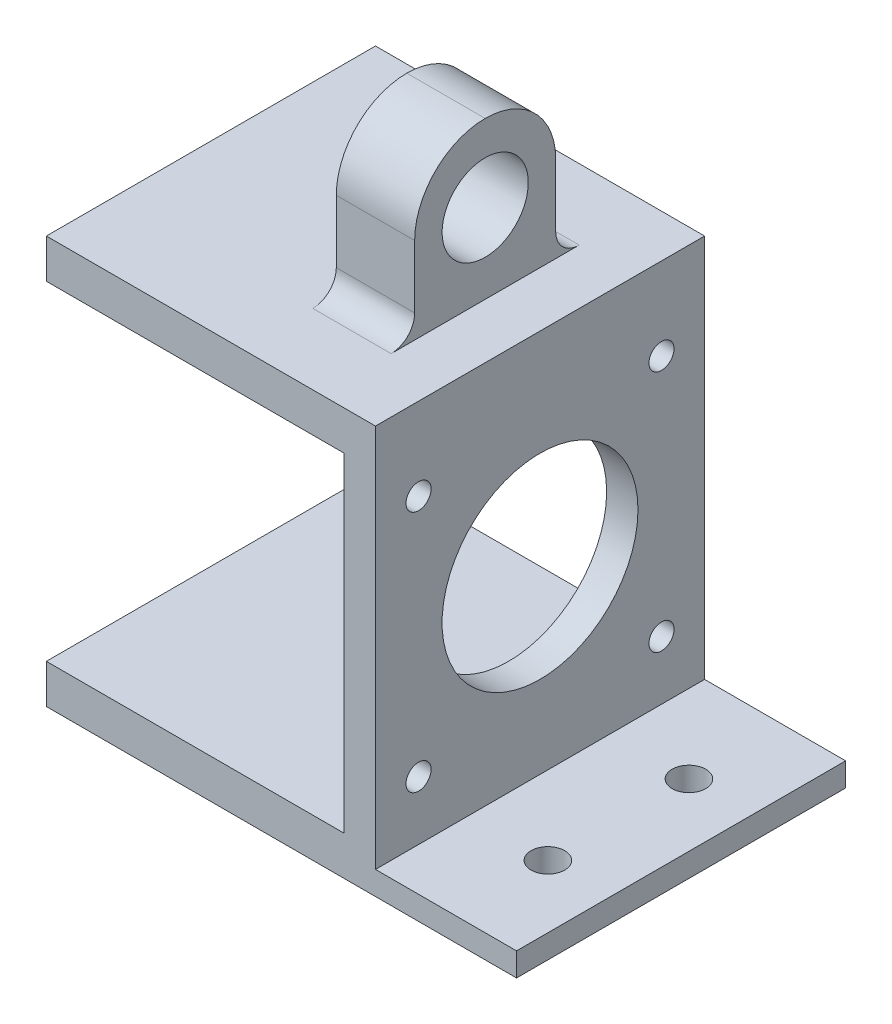
ISO-10303-21;
HEADER;
FILE_DESCRIPTION(('STEP AP214'),'2;1');
FILE_NAME('part.step','',(''),(''),'','','');
FILE_SCHEMA(('AUTOMOTIVE_DESIGN { 1 0 10303 214 1 1 1 1 }'));
ENDSEC;
DATA;
#1=APPLICATION_CONTEXT('core data for automotive mechanical design processes');
#2=APPLICATION_PROTOCOL_DEFINITION('international standard','automotive_design',2000,#1);
#3=PRODUCT_CONTEXT('',#1,'mechanical');
#4=PRODUCT('Part','Part','',(#3));
#5=PRODUCT_RELATED_PRODUCT_CATEGORY('part','',(#4));
#6=PRODUCT_DEFINITION_FORMATION('','',#4);
#7=PRODUCT_DEFINITION_CONTEXT('part definition',#1,'design');
#8=PRODUCT_DEFINITION('design','',#6,#7);
#9=PRODUCT_DEFINITION_SHAPE('','',#8);
#10=(LENGTH_UNIT() NAMED_UNIT(*) SI_UNIT(.MILLI.,.METRE.));
#11=(NAMED_UNIT(*) PLANE_ANGLE_UNIT() SI_UNIT($,.RADIAN.));
#12=(NAMED_UNIT(*) SI_UNIT($,.STERADIAN.) SOLID_ANGLE_UNIT());
#13=UNCERTAINTY_MEASURE_WITH_UNIT(LENGTH_MEASURE(1.E-05),#10,'distance_accuracy_value','');
#14=(GEOMETRIC_REPRESENTATION_CONTEXT(3) GLOBAL_UNCERTAINTY_ASSIGNED_CONTEXT((#13)) GLOBAL_UNIT_ASSIGNED_CONTEXT((#10,
#11,#12)) REPRESENTATION_CONTEXT('',''));
#15=CARTESIAN_POINT('',(0.,0.,0.));
#16=DIRECTION('',(0.,0.,1.));
#17=DIRECTION('',(1.,0.,0.));
#18=AXIS2_PLACEMENT_3D('',#15,#16,#17);
#19=CARTESIAN_POINT('',(0.,3.,0.));
#20=DIRECTION('',(0.,1.,0.));
#21=DIRECTION('',(0.,0.,1.));
#22=AXIS2_PLACEMENT_3D('',#19,#20,#21);
#23=PLANE('',#22);
#24=DIRECTION('',(0.,0.,1.));
#25=VECTOR('',#24,1.);
#26=CARTESIAN_POINT('',(22.,3.,0.));
#27=LINE('',#26,#25);
#28=CARTESIAN_POINT('',(22.,3.,0.));
#29=VERTEX_POINT('',#28);
#30=CARTESIAN_POINT('',(22.,3.,42.));
#31=VERTEX_POINT('',#30);
#32=EDGE_CURVE('E229',#29,#31,#27,.T.);
#33=ORIENTED_EDGE('',*,*,#32,.F.);
#34=DIRECTION('',(-1.,0.,0.));
#35=VECTOR('',#34,1.);
#36=CARTESIAN_POINT('',(0.,3.,0.));
#37=LINE('',#36,#35);
#38=CARTESIAN_POINT('',(4.,3.,0.));
#39=VERTEX_POINT('',#38);
#40=EDGE_CURVE('E178',#29,#39,#37,.T.);
#41=ORIENTED_EDGE('',*,*,#40,.T.);
#42=DIRECTION('',(0.,0.,-1.));
#43=VECTOR('',#42,1.);
#44=CARTESIAN_POINT('',(4.,3.,0.));
#45=LINE('',#44,#43);
#46=CARTESIAN_POINT('',(4.,3.,42.));
#47=VERTEX_POINT('',#46);
#48=EDGE_CURVE('E193',#47,#39,#45,.T.);
#49=ORIENTED_EDGE('',*,*,#48,.F.);
#50=DIRECTION('',(1.,0.,0.));
#51=VECTOR('',#50,1.);
#52=CARTESIAN_POINT('',(0.,3.,42.));
#53=LINE('',#52,#51);
#54=EDGE_CURVE('E186',#47,#31,#53,.T.);
#55=ORIENTED_EDGE('',*,*,#54,.T.);
#56=EDGE_LOOP('',(#33,#41,#49,#55));
#57=FACE_BOUND('',#56,.T.);
#58=CARTESIAN_POINT('',(14.,3.,30.));
#59=DIRECTION('',(0.,1.,0.));
#60=DIRECTION('',(0.,0.,1.));
#61=AXIS2_PLACEMENT_3D('',#58,#59,#60);
#62=CIRCLE('',#61,2.15);
#63=CARTESIAN_POINT('',(14.,3.,32.15));
#64=VERTEX_POINT('',#63);
#65=EDGE_CURVE('E289',#64,#64,#62,.T.);
#66=ORIENTED_EDGE('',*,*,#65,.F.);
#67=EDGE_LOOP('',(#66));
#68=FACE_BOUND('',#67,.T.);
#69=CARTESIAN_POINT('',(14.,3.,12.));
#70=DIRECTION('',(0.,1.,0.));
#71=DIRECTION('',(0.,0.,1.));
#72=AXIS2_PLACEMENT_3D('',#69,#70,#71);
#73=CIRCLE('',#72,2.15);
#74=CARTESIAN_POINT('',(14.,3.,14.15));
#75=VERTEX_POINT('',#74);
#76=EDGE_CURVE('E297',#75,#75,#73,.T.);
#77=ORIENTED_EDGE('',*,*,#76,.F.);
#78=EDGE_LOOP('',(#77));
#79=FACE_BOUND('',#78,.T.);
#80=ADVANCED_FACE('F45',(#57,#68,#79),#23,.T.);
#81=CARTESIAN_POINT('',(0.,3.,42.));
#82=DIRECTION('',(0.,0.,-1.));
#83=DIRECTION('',(-1.,0.,0.));
#84=AXIS2_PLACEMENT_3D('',#81,#82,#83);
#85=PLANE('',#84);
#86=DIRECTION('',(1.,0.,0.));
#87=VECTOR('',#86,1.);
#88=CARTESIAN_POINT('',(0.,0.,42.));
#89=LINE('',#88,#87);
#90=CARTESIAN_POINT('',(-38.,0.,42.));
#91=VERTEX_POINT('',#90);
#92=CARTESIAN_POINT('',(22.,0.,42.));
#93=VERTEX_POINT('',#92);
#94=EDGE_CURVE('E187',#91,#93,#89,.T.);
#95=ORIENTED_EDGE('',*,*,#94,.T.);
#96=DIRECTION('',(0.,1.,0.));
#97=VECTOR('',#96,1.);
#98=CARTESIAN_POINT('',(22.,3.,42.));
#99=LINE('',#98,#97);
#100=EDGE_CURVE('E61',#93,#31,#99,.T.);
#101=ORIENTED_EDGE('',*,*,#100,.T.);
#102=ORIENTED_EDGE('',*,*,#54,.F.);
#103=DIRECTION('',(0.,-1.,0.));
#104=VECTOR('',#103,1.);
#105=CARTESIAN_POINT('',(4.00000000000001,47.,42.));
#106=LINE('',#105,#104);
#107=CARTESIAN_POINT('',(4.,52.,42.));
#108=VERTEX_POINT('',#107);
#109=EDGE_CURVE('E403',#108,#47,#106,.T.);
#110=ORIENTED_EDGE('',*,*,#109,.F.);
#111=DIRECTION('',(1.,0.,0.));
#112=VECTOR('',#111,1.);
#113=CARTESIAN_POINT('',(4.,52.,42.));
#114=LINE('',#113,#112);
#115=CARTESIAN_POINT('',(-38.,52.,42.));
#116=VERTEX_POINT('',#115);
#117=EDGE_CURVE('E316',#116,#108,#114,.T.);
#118=ORIENTED_EDGE('',*,*,#117,.F.);
#119=DIRECTION('',(0.,-1.,0.));
#120=VECTOR('',#119,1.);
#121=CARTESIAN_POINT('',(-38.,52.,42.));
#122=LINE('',#121,#120);
#123=CARTESIAN_POINT('',(-38.,47.,42.));
#124=VERTEX_POINT('',#123);
#125=EDGE_CURVE('E320',#116,#124,#122,.T.);
#126=ORIENTED_EDGE('',*,*,#125,.T.);
#127=DIRECTION('',(1.,0.,0.));
#128=VECTOR('',#127,1.);
#129=CARTESIAN_POINT('',(4.,47.,42.));
#130=LINE('',#129,#128);
#131=CARTESIAN_POINT('',(0.,47.,42.));
#132=VERTEX_POINT('',#131);
#133=EDGE_CURVE('E310',#124,#132,#130,.T.);
#134=ORIENTED_EDGE('',*,*,#133,.T.);
#135=DIRECTION('',(0.,-1.,0.));
#136=VECTOR('',#135,1.);
#137=CARTESIAN_POINT('',(0.,3.,42.));
#138=LINE('',#137,#136);
#139=CARTESIAN_POINT('',(0.,5.,42.));
#140=VERTEX_POINT('',#139);
#141=EDGE_CURVE('E200',#132,#140,#138,.T.);
#142=ORIENTED_EDGE('',*,*,#141,.T.);
#143=DIRECTION('',(1.,0.,0.));
#144=VECTOR('',#143,1.);
#145=CARTESIAN_POINT('',(-38.,5.,42.));
#146=LINE('',#145,#144);
#147=CARTESIAN_POINT('',(-38.,5.,42.));
#148=VERTEX_POINT('',#147);
#149=EDGE_CURVE('E354',#148,#140,#146,.T.);
#150=ORIENTED_EDGE('',*,*,#149,.F.);
#151=DIRECTION('',(0.,1.,0.));
#152=VECTOR('',#151,1.);
#153=CARTESIAN_POINT('',(-38.,0.,42.));
#154=LINE('',#153,#152);
#155=EDGE_CURVE('E341',#91,#148,#154,.T.);
#156=ORIENTED_EDGE('',*,*,#155,.F.);
#157=EDGE_LOOP('',(#95,#101,#102,#110,#118,#126,#134,#142,#150,#156));
#158=FACE_BOUND('',#157,.T.);
#159=ADVANCED_FACE('F425',(#158),#85,.F.);
#160=CARTESIAN_POINT('',(0.,52.,0.));
#161=DIRECTION('',(0.,-1.,0.));
#162=DIRECTION('',(0.,0.,-1.));
#163=AXIS2_PLACEMENT_3D('',#160,#161,#162);
#164=PLANE('',#163);
#165=DIRECTION('',(0.,0.,-1.));
#166=VECTOR('',#165,1.);
#167=CARTESIAN_POINT('',(4.,52.,0.));
#168=LINE('',#167,#166);
#169=CARTESIAN_POINT('',(4.,52.,0.));
#170=VERTEX_POINT('',#169);
#171=EDGE_CURVE('E305',#108,#170,#168,.T.);
#172=ORIENTED_EDGE('',*,*,#171,.T.);
#173=DIRECTION('',(-1.,0.,0.));
#174=VECTOR('',#173,1.);
#175=CARTESIAN_POINT('',(4.,52.,0.));
#176=LINE('',#175,#174);
#177=CARTESIAN_POINT('',(-38.,52.,0.));
#178=VERTEX_POINT('',#177);
#179=EDGE_CURVE('E309',#170,#178,#176,.T.);
#180=ORIENTED_EDGE('',*,*,#179,.T.);
#181=DIRECTION('',(0.,0.,1.));
#182=VECTOR('',#181,1.);
#183=CARTESIAN_POINT('',(-38.,52.,0.));
#184=LINE('',#183,#182);
#185=EDGE_CURVE('E313',#178,#116,#184,.T.);
#186=ORIENTED_EDGE('',*,*,#185,.T.);
#187=ORIENTED_EDGE('',*,*,#117,.T.);
#188=EDGE_LOOP('',(#172,#180,#186,#187));
#189=FACE_BOUND('',#188,.T.);
#190=DIRECTION('',(0.,0.,1.));
#191=VECTOR('',#190,1.);
#192=CARTESIAN_POINT('',(-13.,52.,12.));
#193=LINE('',#192,#191);
#194=CARTESIAN_POINT('',(-13.,52.,9.));
#195=VERTEX_POINT('',#194);
#196=CARTESIAN_POINT('',(-13.,52.,33.));
#197=VERTEX_POINT('',#196);
#198=EDGE_CURVE('E265',#195,#197,#193,.T.);
#199=ORIENTED_EDGE('',*,*,#198,.F.);
#200=DIRECTION('',(-1.,0.,0.));
#201=VECTOR('',#200,1.);
#202=CARTESIAN_POINT('',(-3.,52.,9.));
#203=LINE('',#202,#201);
#204=CARTESIAN_POINT('',(-3.,52.,9.));
#205=VERTEX_POINT('',#204);
#206=EDGE_CURVE('E237',#195,#205,#203,.F.);
#207=ORIENTED_EDGE('',*,*,#206,.T.);
#208=DIRECTION('',(0.,0.,-1.));
#209=VECTOR('',#208,1.);
#210=CARTESIAN_POINT('',(-3.,52.,12.));
#211=LINE('',#210,#209);
#212=CARTESIAN_POINT('',(-2.99999999999999,52.,33.));
#213=VERTEX_POINT('',#212);
#214=EDGE_CURVE('E258',#213,#205,#211,.T.);
#215=ORIENTED_EDGE('',*,*,#214,.F.);
#216=DIRECTION('',(1.,0.,0.));
#217=VECTOR('',#216,1.);
#218=CARTESIAN_POINT('',(-13.,52.,33.));
#219=LINE('',#218,#217);
#220=EDGE_CURVE('E233',#213,#197,#219,.F.);
#221=ORIENTED_EDGE('',*,*,#220,.T.);
#222=EDGE_LOOP('',(#199,#207,#215,#221));
#223=FACE_BOUND('',#222,.T.);
#224=ADVANCED_FACE('F264',(#189,#223),#164,.F.);
#225=CARTESIAN_POINT('',(0.,3.,0.));
#226=DIRECTION('',(1.,0.,0.));
#227=DIRECTION('',(0.,0.,-1.));
#228=AXIS2_PLACEMENT_3D('',#225,#226,#227);
#229=PLANE('',#228);
#230=CARTESIAN_POINT('',(0.,26.,21.));
#231=DIRECTION('',(1.,0.,0.));
#232=DIRECTION('',(0.,0.,-1.));
#233=AXIS2_PLACEMENT_3D('',#230,#231,#232);
#234=CIRCLE('',#233,12.5);
#235=CARTESIAN_POINT('',(0.,26.,8.50000000000001));
#236=VERTEX_POINT('',#235);
#237=EDGE_CURVE('E363',#236,#236,#234,.T.);
#238=ORIENTED_EDGE('',*,*,#237,.T.);
#239=EDGE_LOOP('',(#238));
#240=FACE_BOUND('',#239,.T.);
#241=CARTESIAN_POINT('',(0.,41.5,36.5));
#242=DIRECTION('',(1.,0.,0.));
#243=DIRECTION('',(0.,0.,-1.));
#244=AXIS2_PLACEMENT_3D('',#241,#242,#243);
#245=CIRCLE('',#244,1.6);
#246=CARTESIAN_POINT('',(0.,41.5,34.9));
#247=VERTEX_POINT('',#246);
#248=EDGE_CURVE('E359',#247,#247,#245,.T.);
#249=ORIENTED_EDGE('',*,*,#248,.T.);
#250=EDGE_LOOP('',(#249));
#251=FACE_BOUND('',#250,.T.);
#252=CARTESIAN_POINT('',(0.,41.5,5.5));
#253=DIRECTION('',(1.,0.,0.));
#254=DIRECTION('',(0.,0.,-1.));
#255=AXIS2_PLACEMENT_3D('',#252,#253,#254);
#256=CIRCLE('',#255,1.6);
#257=CARTESIAN_POINT('',(0.,41.5,3.9));
#258=VERTEX_POINT('',#257);
#259=EDGE_CURVE('E364',#258,#258,#256,.T.);
#260=ORIENTED_EDGE('',*,*,#259,.T.);
#261=EDGE_LOOP('',(#260));
#262=FACE_BOUND('',#261,.T.);
#263=CARTESIAN_POINT('',(0.,10.5,36.5));
#264=DIRECTION('',(1.,0.,0.));
#265=DIRECTION('',(0.,0.,-1.));
#266=AXIS2_PLACEMENT_3D('',#263,#264,#265);
#267=CIRCLE('',#266,1.6);
#268=CARTESIAN_POINT('',(0.,10.5,34.9));
#269=VERTEX_POINT('',#268);
#270=EDGE_CURVE('E368',#269,#269,#267,.T.);
#271=ORIENTED_EDGE('',*,*,#270,.T.);
#272=EDGE_LOOP('',(#271));
#273=FACE_BOUND('',#272,.T.);
#274=CARTESIAN_POINT('',(0.,10.5,5.5));
#275=DIRECTION('',(1.,0.,0.));
#276=DIRECTION('',(0.,0.,-1.));
#277=AXIS2_PLACEMENT_3D('',#274,#275,#276);
#278=CIRCLE('',#277,1.6);
#279=CARTESIAN_POINT('',(0.,10.5,3.9));
#280=VERTEX_POINT('',#279);
#281=EDGE_CURVE('E358',#280,#280,#278,.T.);
#282=ORIENTED_EDGE('',*,*,#281,.T.);
#283=EDGE_LOOP('',(#282));
#284=FACE_BOUND('',#283,.T.);
#285=DIRECTION('',(0.,0.,-1.));
#286=VECTOR('',#285,1.);
#287=CARTESIAN_POINT('',(0.,5.,0.));
#288=LINE('',#287,#286);
#289=CARTESIAN_POINT('',(0.,5.,0.));
#290=VERTEX_POINT('',#289);
#291=EDGE_CURVE('E335',#140,#290,#288,.T.);
#292=ORIENTED_EDGE('',*,*,#291,.F.);
#293=ORIENTED_EDGE('',*,*,#141,.F.);
#294=DIRECTION('',(0.,0.,-1.));
#295=VECTOR('',#294,1.);
#296=CARTESIAN_POINT('',(0.,47.,42.));
#297=LINE('',#296,#295);
#298=CARTESIAN_POINT('',(0.,47.,0.));
#299=VERTEX_POINT('',#298);
#300=EDGE_CURVE('E398',#132,#299,#297,.T.);
#301=ORIENTED_EDGE('',*,*,#300,.T.);
#302=DIRECTION('',(0.,-1.,0.));
#303=VECTOR('',#302,1.);
#304=CARTESIAN_POINT('',(0.,3.,0.));
#305=LINE('',#304,#303);
#306=EDGE_CURVE('E197',#299,#290,#305,.T.);
#307=ORIENTED_EDGE('',*,*,#306,.T.);
#308=EDGE_LOOP('',(#292,#293,#301,#307));
#309=FACE_BOUND('',#308,.T.);
#310=ADVANCED_FACE('F471',(#240,#251,#262,#273,#284,#309),#229,.F.);
#311=CARTESIAN_POINT('',(0.,3.,0.));
#312=DIRECTION('',(0.,0.,1.));
#313=DIRECTION('',(1.,0.,0.));
#314=AXIS2_PLACEMENT_3D('',#311,#312,#313);
#315=PLANE('',#314);
#316=ORIENTED_EDGE('',*,*,#40,.F.);
#317=DIRECTION('',(0.,-1.,0.));
#318=VECTOR('',#317,1.);
#319=CARTESIAN_POINT('',(22.,72.,0.));
#320=LINE('',#319,#318);
#321=CARTESIAN_POINT('',(22.,0.,0.));
#322=VERTEX_POINT('',#321);
#323=EDGE_CURVE('E164',#29,#322,#320,.T.);
#324=ORIENTED_EDGE('',*,*,#323,.T.);
#325=DIRECTION('',(-1.,0.,0.));
#326=VECTOR('',#325,1.);
#327=CARTESIAN_POINT('',(0.,0.,0.));
#328=LINE('',#327,#326);
#329=CARTESIAN_POINT('',(-38.,0.,0.));
#330=VERTEX_POINT('',#329);
#331=EDGE_CURVE('E175',#322,#330,#328,.T.);
#332=ORIENTED_EDGE('',*,*,#331,.T.);
#333=DIRECTION('',(0.,-1.,0.));
#334=VECTOR('',#333,1.);
#335=CARTESIAN_POINT('',(-38.,0.,0.));
#336=LINE('',#335,#334);
#337=CARTESIAN_POINT('',(-38.,5.,0.));
#338=VERTEX_POINT('',#337);
#339=EDGE_CURVE('E336',#338,#330,#336,.T.);
#340=ORIENTED_EDGE('',*,*,#339,.F.);
#341=DIRECTION('',(1.,0.,0.));
#342=VECTOR('',#341,1.);
#343=CARTESIAN_POINT('',(-38.,5.,0.));
#344=LINE('',#343,#342);
#345=EDGE_CURVE('E347',#338,#290,#344,.T.);
#346=ORIENTED_EDGE('',*,*,#345,.T.);
#347=ORIENTED_EDGE('',*,*,#306,.F.);
#348=DIRECTION('',(-1.,0.,0.));
#349=VECTOR('',#348,1.);
#350=CARTESIAN_POINT('',(4.,47.,0.));
#351=LINE('',#350,#349);
#352=CARTESIAN_POINT('',(-38.,47.,0.));
#353=VERTEX_POINT('',#352);
#354=EDGE_CURVE('E301',#299,#353,#351,.T.);
#355=ORIENTED_EDGE('',*,*,#354,.T.);
#356=DIRECTION('',(0.,-1.,0.));
#357=VECTOR('',#356,1.);
#358=CARTESIAN_POINT('',(-38.,52.,0.));
#359=LINE('',#358,#357);
#360=EDGE_CURVE('E331',#178,#353,#359,.T.);
#361=ORIENTED_EDGE('',*,*,#360,.F.);
#362=ORIENTED_EDGE('',*,*,#179,.F.);
#363=DIRECTION('',(0.,-1.,0.));
#364=VECTOR('',#363,1.);
#365=CARTESIAN_POINT('',(4.,47.,0.));
#366=LINE('',#365,#364);
#367=EDGE_CURVE('E402',#170,#39,#366,.T.);
#368=ORIENTED_EDGE('',*,*,#367,.T.);
#369=EDGE_LOOP('',(#316,#324,#332,#340,#346,#347,#355,#361,#362,#368));
#370=FACE_BOUND('',#369,.T.);
#371=ADVANCED_FACE('F173',(#370),#315,.F.);
#372=CARTESIAN_POINT('',(0.,0.,0.));
#373=DIRECTION('',(0.,1.,0.));
#374=DIRECTION('',(0.,0.,1.));
#375=AXIS2_PLACEMENT_3D('',#372,#373,#374);
#376=PLANE('',#375);
#377=CARTESIAN_POINT('',(14.,0.,30.));
#378=DIRECTION('',(0.,1.,0.));
#379=DIRECTION('',(0.,0.,1.));
#380=AXIS2_PLACEMENT_3D('',#377,#378,#379);
#381=CIRCLE('',#380,2.15);
#382=CARTESIAN_POINT('',(14.,0.,32.15));
#383=VERTEX_POINT('',#382);
#384=EDGE_CURVE('E288',#383,#383,#381,.T.);
#385=ORIENTED_EDGE('',*,*,#384,.T.);
#386=EDGE_LOOP('',(#385));
#387=FACE_BOUND('',#386,.T.);
#388=CARTESIAN_POINT('',(14.,0.,12.));
#389=DIRECTION('',(0.,1.,0.));
#390=DIRECTION('',(0.,0.,1.));
#391=AXIS2_PLACEMENT_3D('',#388,#389,#390);
#392=CIRCLE('',#391,2.15);
#393=CARTESIAN_POINT('',(14.,0.,14.15));
#394=VERTEX_POINT('',#393);
#395=EDGE_CURVE('E293',#394,#394,#392,.T.);
#396=ORIENTED_EDGE('',*,*,#395,.T.);
#397=EDGE_LOOP('',(#396));
#398=FACE_BOUND('',#397,.T.);
#399=ORIENTED_EDGE('',*,*,#331,.F.);
#400=DIRECTION('',(0.,0.,-1.));
#401=VECTOR('',#400,1.);
#402=CARTESIAN_POINT('',(22.,0.,120.));
#403=LINE('',#402,#401);
#404=EDGE_CURVE('E161',#93,#322,#403,.T.);
#405=ORIENTED_EDGE('',*,*,#404,.F.);
#406=ORIENTED_EDGE('',*,*,#94,.F.);
#407=DIRECTION('',(0.,0.,1.));
#408=VECTOR('',#407,1.);
#409=CARTESIAN_POINT('',(-38.,0.,0.));
#410=LINE('',#409,#408);
#411=EDGE_CURVE('E183',#330,#91,#410,.T.);
#412=ORIENTED_EDGE('',*,*,#411,.F.);
#413=EDGE_LOOP('',(#399,#405,#406,#412));
#414=FACE_BOUND('',#413,.T.);
#415=ADVANCED_FACE('F181',(#387,#398,#414),#376,.F.);
#416=CARTESIAN_POINT('',(4.00000000000001,47.,42.));
#417=DIRECTION('',(1.,0.,0.));
#418=DIRECTION('',(0.,0.,-1.));
#419=AXIS2_PLACEMENT_3D('',#416,#417,#418);
#420=PLANE('',#419);
#421=CARTESIAN_POINT('',(4.,10.5,5.5));
#422=DIRECTION('',(1.,0.,0.));
#423=DIRECTION('',(0.,0.,-1.));
#424=AXIS2_PLACEMENT_3D('',#421,#422,#423);
#425=CIRCLE('',#424,1.6);
#426=CARTESIAN_POINT('',(4.,10.5,3.9));
#427=VERTEX_POINT('',#426);
#428=EDGE_CURVE('E394',#427,#427,#425,.T.);
#429=ORIENTED_EDGE('',*,*,#428,.F.);
#430=EDGE_LOOP('',(#429));
#431=FACE_BOUND('',#430,.T.);
#432=CARTESIAN_POINT('',(4.00000000000001,10.5,36.5));
#433=DIRECTION('',(1.,0.,0.));
#434=DIRECTION('',(0.,0.,-1.));
#435=AXIS2_PLACEMENT_3D('',#432,#433,#434);
#436=CIRCLE('',#435,1.6);
#437=CARTESIAN_POINT('',(4.00000000000001,10.5,34.9));
#438=VERTEX_POINT('',#437);
#439=EDGE_CURVE('E390',#438,#438,#436,.T.);
#440=ORIENTED_EDGE('',*,*,#439,.F.);
#441=EDGE_LOOP('',(#440));
#442=FACE_BOUND('',#441,.T.);
#443=CARTESIAN_POINT('',(4.,41.5,5.5));
#444=DIRECTION('',(1.,0.,0.));
#445=DIRECTION('',(0.,0.,-1.));
#446=AXIS2_PLACEMENT_3D('',#443,#444,#445);
#447=CIRCLE('',#446,1.6);
#448=CARTESIAN_POINT('',(4.,41.5,3.9));
#449=VERTEX_POINT('',#448);
#450=EDGE_CURVE('E386',#449,#449,#447,.T.);
#451=ORIENTED_EDGE('',*,*,#450,.F.);
#452=EDGE_LOOP('',(#451));
#453=FACE_BOUND('',#452,.T.);
#454=CARTESIAN_POINT('',(4.00000000000001,41.5,36.5));
#455=DIRECTION('',(1.,0.,0.));
#456=DIRECTION('',(0.,0.,-1.));
#457=AXIS2_PLACEMENT_3D('',#454,#455,#456);
#458=CIRCLE('',#457,1.6);
#459=CARTESIAN_POINT('',(4.00000000000001,41.5,34.9));
#460=VERTEX_POINT('',#459);
#461=EDGE_CURVE('E382',#460,#460,#458,.T.);
#462=ORIENTED_EDGE('',*,*,#461,.F.);
#463=EDGE_LOOP('',(#462));
#464=FACE_BOUND('',#463,.T.);
#465=CARTESIAN_POINT('',(4.,26.,21.));
#466=DIRECTION('',(1.,0.,0.));
#467=DIRECTION('',(0.,0.,-1.));
#468=AXIS2_PLACEMENT_3D('',#465,#466,#467);
#469=CIRCLE('',#468,12.5);
#470=CARTESIAN_POINT('',(4.,26.,8.50000000000001));
#471=VERTEX_POINT('',#470);
#472=EDGE_CURVE('E378',#471,#471,#469,.T.);
#473=ORIENTED_EDGE('',*,*,#472,.F.);
#474=EDGE_LOOP('',(#473));
#475=FACE_BOUND('',#474,.T.);
#476=ORIENTED_EDGE('',*,*,#109,.T.);
#477=ORIENTED_EDGE('',*,*,#48,.T.);
#478=ORIENTED_EDGE('',*,*,#367,.F.);
#479=ORIENTED_EDGE('',*,*,#171,.F.);
#480=EDGE_LOOP('',(#476,#477,#478,#479));
#481=FACE_BOUND('',#480,.T.);
#482=ADVANCED_FACE('F416',(#431,#442,#453,#464,#475,#481),#420,.T.);
#483=CARTESIAN_POINT('',(0.,26.,21.));
#484=DIRECTION('',(1.,0.,0.));
#485=DIRECTION('',(0.,0.,-1.));
#486=AXIS2_PLACEMENT_3D('',#483,#484,#485);
#487=CYLINDRICAL_SURFACE('',#486,12.5);
#488=ORIENTED_EDGE('',*,*,#472,.T.);
#489=EDGE_LOOP('',(#488));
#490=FACE_BOUND('',#489,.T.);
#491=ORIENTED_EDGE('',*,*,#237,.F.);
#492=EDGE_LOOP('',(#491));
#493=FACE_BOUND('',#492,.T.);
#494=ADVANCED_FACE('F534',(#490,#493),#487,.F.);
#495=CARTESIAN_POINT('',(0.,41.5,36.5));
#496=DIRECTION('',(1.,0.,0.));
#497=DIRECTION('',(0.,0.,-1.));
#498=AXIS2_PLACEMENT_3D('',#495,#496,#497);
#499=CYLINDRICAL_SURFACE('',#498,1.6);
#500=ORIENTED_EDGE('',*,*,#461,.T.);
#501=EDGE_LOOP('',(#500));
#502=FACE_BOUND('',#501,.T.);
#503=ORIENTED_EDGE('',*,*,#248,.F.);
#504=EDGE_LOOP('',(#503));
#505=FACE_BOUND('',#504,.T.);
#506=ADVANCED_FACE('F530',(#502,#505),#499,.F.);
#507=CARTESIAN_POINT('',(0.,41.5,5.5));
#508=DIRECTION('',(1.,0.,0.));
#509=DIRECTION('',(0.,0.,-1.));
#510=AXIS2_PLACEMENT_3D('',#507,#508,#509);
#511=CYLINDRICAL_SURFACE('',#510,1.6);
#512=ORIENTED_EDGE('',*,*,#450,.T.);
#513=EDGE_LOOP('',(#512));
#514=FACE_BOUND('',#513,.T.);
#515=ORIENTED_EDGE('',*,*,#259,.F.);
#516=EDGE_LOOP('',(#515));
#517=FACE_BOUND('',#516,.T.);
#518=ADVANCED_FACE('F533',(#514,#517),#511,.F.);
#519=CARTESIAN_POINT('',(0.,10.5,36.5));
#520=DIRECTION('',(1.,0.,0.));
#521=DIRECTION('',(0.,0.,-1.));
#522=AXIS2_PLACEMENT_3D('',#519,#520,#521);
#523=CYLINDRICAL_SURFACE('',#522,1.6);
#524=ORIENTED_EDGE('',*,*,#439,.T.);
#525=EDGE_LOOP('',(#524));
#526=FACE_BOUND('',#525,.T.);
#527=ORIENTED_EDGE('',*,*,#270,.F.);
#528=EDGE_LOOP('',(#527));
#529=FACE_BOUND('',#528,.T.);
#530=ADVANCED_FACE('F538',(#526,#529),#523,.F.);
#531=CARTESIAN_POINT('',(0.,10.5,5.5));
#532=DIRECTION('',(1.,0.,0.));
#533=DIRECTION('',(0.,0.,-1.));
#534=AXIS2_PLACEMENT_3D('',#531,#532,#533);
#535=CYLINDRICAL_SURFACE('',#534,1.6);
#536=ORIENTED_EDGE('',*,*,#428,.T.);
#537=EDGE_LOOP('',(#536));
#538=FACE_BOUND('',#537,.T.);
#539=ORIENTED_EDGE('',*,*,#281,.F.);
#540=EDGE_LOOP('',(#539));
#541=FACE_BOUND('',#540,.T.);
#542=ADVANCED_FACE('F528',(#538,#541),#535,.F.);
#543=CARTESIAN_POINT('',(-38.,5.,0.));
#544=DIRECTION('',(0.,-1.,0.));
#545=DIRECTION('',(0.,0.,-1.));
#546=AXIS2_PLACEMENT_3D('',#543,#544,#545);
#547=PLANE('',#546);
#548=ORIENTED_EDGE('',*,*,#291,.T.);
#549=ORIENTED_EDGE('',*,*,#345,.F.);
#550=DIRECTION('',(0.,0.,-1.));
#551=VECTOR('',#550,1.);
#552=CARTESIAN_POINT('',(-38.,5.,0.));
#553=LINE('',#552,#551);
#554=EDGE_CURVE('E344',#148,#338,#553,.T.);
#555=ORIENTED_EDGE('',*,*,#554,.F.);
#556=ORIENTED_EDGE('',*,*,#149,.T.);
#557=EDGE_LOOP('',(#548,#549,#555,#556));
#558=FACE_BOUND('',#557,.T.);
#559=ADVANCED_FACE('F524',(#558),#547,.F.);
#560=CARTESIAN_POINT('',(-38.,0.,0.));
#561=DIRECTION('',(1.,0.,0.));
#562=DIRECTION('',(0.,0.,-1.));
#563=AXIS2_PLACEMENT_3D('',#560,#561,#562);
#564=PLANE('',#563);
#565=ORIENTED_EDGE('',*,*,#339,.T.);
#566=ORIENTED_EDGE('',*,*,#411,.T.);
#567=ORIENTED_EDGE('',*,*,#155,.T.);
#568=ORIENTED_EDGE('',*,*,#554,.T.);
#569=EDGE_LOOP('',(#565,#566,#567,#568));
#570=FACE_BOUND('',#569,.T.);
#571=ADVANCED_FACE('F517',(#570),#564,.F.);
#572=CARTESIAN_POINT('',(0.,47.,0.));
#573=DIRECTION('',(0.,-1.,0.));
#574=DIRECTION('',(0.,0.,-1.));
#575=AXIS2_PLACEMENT_3D('',#572,#573,#574);
#576=PLANE('',#575);
#577=ORIENTED_EDGE('',*,*,#300,.F.);
#578=ORIENTED_EDGE('',*,*,#133,.F.);
#579=DIRECTION('',(0.,0.,1.));
#580=VECTOR('',#579,1.);
#581=CARTESIAN_POINT('',(-38.,47.,0.));
#582=LINE('',#581,#580);
#583=EDGE_CURVE('E323',#353,#124,#582,.T.);
#584=ORIENTED_EDGE('',*,*,#583,.F.);
#585=ORIENTED_EDGE('',*,*,#354,.F.);
#586=EDGE_LOOP('',(#577,#578,#584,#585));
#587=FACE_BOUND('',#586,.T.);
#588=ADVANCED_FACE('F514',(#587),#576,.T.);
#589=CARTESIAN_POINT('',(-38.,52.,0.));
#590=DIRECTION('',(1.,0.,0.));
#591=DIRECTION('',(0.,0.,-1.));
#592=AXIS2_PLACEMENT_3D('',#589,#590,#591);
#593=PLANE('',#592);
#594=ORIENTED_EDGE('',*,*,#583,.T.);
#595=ORIENTED_EDGE('',*,*,#125,.F.);
#596=ORIENTED_EDGE('',*,*,#185,.F.);
#597=ORIENTED_EDGE('',*,*,#360,.T.);
#598=EDGE_LOOP('',(#594,#595,#596,#597));
#599=FACE_BOUND('',#598,.T.);
#600=ADVANCED_FACE('F511',(#599),#593,.F.);
#601=CARTESIAN_POINT('',(14.,0.,12.));
#602=DIRECTION('',(0.,1.,0.));
#603=DIRECTION('',(0.,0.,1.));
#604=AXIS2_PLACEMENT_3D('',#601,#602,#603);
#605=CYLINDRICAL_SURFACE('',#604,2.15);
#606=ORIENTED_EDGE('',*,*,#395,.F.);
#607=EDGE_LOOP('',(#606));
#608=FACE_BOUND('',#607,.T.);
#609=ORIENTED_EDGE('',*,*,#76,.T.);
#610=EDGE_LOOP('',(#609));
#611=FACE_BOUND('',#610,.T.);
#612=ADVANCED_FACE('F503',(#608,#611),#605,.F.);
#613=CARTESIAN_POINT('',(14.,0.,30.));
#614=DIRECTION('',(0.,1.,0.));
#615=DIRECTION('',(0.,0.,1.));
#616=AXIS2_PLACEMENT_3D('',#613,#614,#615);
#617=CYLINDRICAL_SURFACE('',#616,2.15);
#618=ORIENTED_EDGE('',*,*,#384,.F.);
#619=EDGE_LOOP('',(#618));
#620=FACE_BOUND('',#619,.T.);
#621=ORIENTED_EDGE('',*,*,#65,.T.);
#622=EDGE_LOOP('',(#621));
#623=FACE_BOUND('',#622,.T.);
#624=ADVANCED_FACE('F495',(#620,#623),#617,.F.);
#625=CARTESIAN_POINT('',(-13.,72.,12.));
#626=DIRECTION('',(1.,0.,0.));
#627=DIRECTION('',(0.,0.,-1.));
#628=AXIS2_PLACEMENT_3D('',#625,#626,#627);
#629=PLANE('',#628);
#630=CARTESIAN_POINT('',(-13.,62.15,21.));
#631=DIRECTION('',(-1.,0.,0.));
#632=DIRECTION('',(0.,0.,1.));
#633=AXIS2_PLACEMENT_3D('',#630,#631,#632);
#634=CIRCLE('',#633,5.5);
#635=CARTESIAN_POINT('',(-13.,62.15,26.5));
#636=VERTEX_POINT('',#635);
#637=EDGE_CURVE('E228',#636,#636,#634,.T.);
#638=ORIENTED_EDGE('',*,*,#637,.F.);
#639=EDGE_LOOP('',(#638));
#640=FACE_BOUND('',#639,.T.);
#641=CARTESIAN_POINT('',(-13.,63.,21.));
#642=DIRECTION('',(1.,0.,0.));
#643=DIRECTION('',(0.,0.,-1.));
#644=AXIS2_PLACEMENT_3D('',#641,#642,#643);
#645=CIRCLE('',#644,9.);
#646=CARTESIAN_POINT('',(-13.,63.,30.));
#647=VERTEX_POINT('',#646);
#648=CARTESIAN_POINT('',(-13.,72.,21.));
#649=VERTEX_POINT('',#648);
#650=EDGE_CURVE('E204',#647,#649,#645,.F.);
#651=ORIENTED_EDGE('',*,*,#650,.T.);
#652=CARTESIAN_POINT('',(-13.,63.,21.));
#653=DIRECTION('',(1.,0.,0.));
#654=DIRECTION('',(0.,0.,-1.));
#655=AXIS2_PLACEMENT_3D('',#652,#653,#654);
#656=CIRCLE('',#655,9.);
#657=CARTESIAN_POINT('',(-13.,63.,12.));
#658=VERTEX_POINT('',#657);
#659=EDGE_CURVE('E207',#649,#658,#656,.F.);
#660=ORIENTED_EDGE('',*,*,#659,.T.);
#661=DIRECTION('',(0.,-1.,0.));
#662=VECTOR('',#661,1.);
#663=CARTESIAN_POINT('',(-13.,72.,12.));
#664=LINE('',#663,#662);
#665=CARTESIAN_POINT('',(-13.,55.,12.));
#666=VERTEX_POINT('',#665);
#667=EDGE_CURVE('E269',#658,#666,#664,.T.);
#668=ORIENTED_EDGE('',*,*,#667,.T.);
#669=CARTESIAN_POINT('',(-13.,55.,9.));
#670=DIRECTION('',(1.,0.,0.));
#671=DIRECTION('',(0.,0.,-1.));
#672=AXIS2_PLACEMENT_3D('',#669,#670,#671);
#673=CIRCLE('',#672,3.);
#674=EDGE_CURVE('E245',#666,#195,#673,.T.);
#675=ORIENTED_EDGE('',*,*,#674,.T.);
#676=ORIENTED_EDGE('',*,*,#198,.T.);
#677=CARTESIAN_POINT('',(-13.,55.,33.));
#678=DIRECTION('',(1.,0.,0.));
#679=DIRECTION('',(0.,0.,-1.));
#680=AXIS2_PLACEMENT_3D('',#677,#678,#679);
#681=CIRCLE('',#680,3.);
#682=CARTESIAN_POINT('',(-13.,55.,30.));
#683=VERTEX_POINT('',#682);
#684=EDGE_CURVE('E11',#197,#683,#681,.T.);
#685=ORIENTED_EDGE('',*,*,#684,.T.);
#686=DIRECTION('',(0.,-1.,0.));
#687=VECTOR('',#686,1.);
#688=CARTESIAN_POINT('',(-13.,72.,30.));
#689=LINE('',#688,#687);
#690=EDGE_CURVE('E285',#647,#683,#689,.T.);
#691=ORIENTED_EDGE('',*,*,#690,.F.);
#692=EDGE_LOOP('',(#651,#660,#668,#675,#676,#685,#691));
#693=FACE_BOUND('',#692,.T.);
#694=ADVANCED_FACE('F493',(#640,#693),#629,.F.);
#695=CARTESIAN_POINT('',(-13.,72.,30.));
#696=DIRECTION('',(0.,0.,-1.));
#697=DIRECTION('',(-1.,0.,0.));
#698=AXIS2_PLACEMENT_3D('',#695,#696,#697);
#699=PLANE('',#698);
#700=ORIENTED_EDGE('',*,*,#690,.T.);
#701=DIRECTION('',(1.,0.,0.));
#702=VECTOR('',#701,1.);
#703=CARTESIAN_POINT('',(-2.99999999999999,55.,30.));
#704=LINE('',#703,#702);
#705=CARTESIAN_POINT('',(-2.99999999999999,55.,30.));
#706=VERTEX_POINT('',#705);
#707=EDGE_CURVE('E241',#683,#706,#704,.T.);
#708=ORIENTED_EDGE('',*,*,#707,.T.);
#709=DIRECTION('',(0.,-1.,0.));
#710=VECTOR('',#709,1.);
#711=CARTESIAN_POINT('',(-2.99999999999999,72.,30.));
#712=LINE('',#711,#710);
#713=CARTESIAN_POINT('',(-2.99999999999999,63.,30.));
#714=VERTEX_POINT('',#713);
#715=EDGE_CURVE('E260',#714,#706,#712,.T.);
#716=ORIENTED_EDGE('',*,*,#715,.F.);
#717=DIRECTION('',(1.,0.,0.));
#718=VECTOR('',#717,1.);
#719=CARTESIAN_POINT('',(-13.,63.,30.));
#720=LINE('',#719,#718);
#721=EDGE_CURVE('E220',#714,#647,#720,.F.);
#722=ORIENTED_EDGE('',*,*,#721,.T.);
#723=EDGE_LOOP('',(#700,#708,#716,#722));
#724=FACE_BOUND('',#723,.T.);
#725=ADVANCED_FACE('F492',(#724),#699,.F.);
#726=CARTESIAN_POINT('',(-3.,72.,12.));
#727=DIRECTION('',(-1.,0.,0.));
#728=DIRECTION('',(0.,0.,1.));
#729=AXIS2_PLACEMENT_3D('',#726,#727,#728);
#730=PLANE('',#729);
#731=CARTESIAN_POINT('',(-3.,62.15,21.));
#732=DIRECTION('',(-1.,0.,0.));
#733=DIRECTION('',(0.,0.,1.));
#734=AXIS2_PLACEMENT_3D('',#731,#732,#733);
#735=CIRCLE('',#734,5.5);
#736=CARTESIAN_POINT('',(-3.,62.15,26.5));
#737=VERTEX_POINT('',#736);
#738=EDGE_CURVE('E276',#737,#737,#735,.T.);
#739=ORIENTED_EDGE('',*,*,#738,.T.);
#740=EDGE_LOOP('',(#739));
#741=FACE_BOUND('',#740,.T.);
#742=DIRECTION('',(0.,-1.,0.));
#743=VECTOR('',#742,1.);
#744=CARTESIAN_POINT('',(-3.,72.,12.));
#745=LINE('',#744,#743);
#746=CARTESIAN_POINT('',(-3.,63.,12.));
#747=VERTEX_POINT('',#746);
#748=CARTESIAN_POINT('',(-3.,55.,12.));
#749=VERTEX_POINT('',#748);
#750=EDGE_CURVE('E274',#747,#749,#745,.T.);
#751=ORIENTED_EDGE('',*,*,#750,.F.);
#752=CARTESIAN_POINT('',(-2.99999999999999,63.,21.));
#753=DIRECTION('',(-1.,0.,0.));
#754=DIRECTION('',(0.,0.,1.));
#755=AXIS2_PLACEMENT_3D('',#752,#753,#754);
#756=CIRCLE('',#755,9.);
#757=CARTESIAN_POINT('',(-2.99999999999999,72.,21.));
#758=VERTEX_POINT('',#757);
#759=EDGE_CURVE('E217',#747,#758,#756,.F.);
#760=ORIENTED_EDGE('',*,*,#759,.T.);
#761=CARTESIAN_POINT('',(-2.99999999999999,63.,21.));
#762=DIRECTION('',(-1.,0.,0.));
#763=DIRECTION('',(0.,0.,1.));
#764=AXIS2_PLACEMENT_3D('',#761,#762,#763);
#765=CIRCLE('',#764,9.);
#766=EDGE_CURVE('E214',#758,#714,#765,.F.);
#767=ORIENTED_EDGE('',*,*,#766,.T.);
#768=ORIENTED_EDGE('',*,*,#715,.T.);
#769=CARTESIAN_POINT('',(-2.99999999999999,55.,33.));
#770=DIRECTION('',(-1.,0.,0.));
#771=DIRECTION('',(0.,0.,1.));
#772=AXIS2_PLACEMENT_3D('',#769,#770,#771);
#773=CIRCLE('',#772,3.);
#774=EDGE_CURVE('E54',#706,#213,#773,.T.);
#775=ORIENTED_EDGE('',*,*,#774,.T.);
#776=ORIENTED_EDGE('',*,*,#214,.T.);
#777=CARTESIAN_POINT('',(-3.,55.,9.));
#778=DIRECTION('',(-1.,0.,0.));
#779=DIRECTION('',(0.,0.,1.));
#780=AXIS2_PLACEMENT_3D('',#777,#778,#779);
#781=CIRCLE('',#780,3.);
#782=EDGE_CURVE('E249',#205,#749,#781,.T.);
#783=ORIENTED_EDGE('',*,*,#782,.T.);
#784=EDGE_LOOP('',(#751,#760,#767,#768,#775,#776,#783));
#785=FACE_BOUND('',#784,.T.);
#786=ADVANCED_FACE('F257',(#741,#785),#730,.F.);
#787=CARTESIAN_POINT('',(-13.,72.,12.));
#788=DIRECTION('',(0.,0.,1.));
#789=DIRECTION('',(1.,0.,0.));
#790=AXIS2_PLACEMENT_3D('',#787,#788,#789);
#791=PLANE('',#790);
#792=ORIENTED_EDGE('',*,*,#750,.T.);
#793=DIRECTION('',(-1.,0.,0.));
#794=VECTOR('',#793,1.);
#795=CARTESIAN_POINT('',(-13.,55.,12.));
#796=LINE('',#795,#794);
#797=EDGE_CURVE('E223',#749,#666,#796,.T.);
#798=ORIENTED_EDGE('',*,*,#797,.T.);
#799=ORIENTED_EDGE('',*,*,#667,.F.);
#800=DIRECTION('',(-1.,0.,0.));
#801=VECTOR('',#800,1.);
#802=CARTESIAN_POINT('',(-3.,63.,12.));
#803=LINE('',#802,#801);
#804=EDGE_CURVE('E210',#658,#747,#803,.F.);
#805=ORIENTED_EDGE('',*,*,#804,.T.);
#806=EDGE_LOOP('',(#792,#798,#799,#805));
#807=FACE_BOUND('',#806,.T.);
#808=ADVANCED_FACE('F443',(#807),#791,.F.);
#809=CARTESIAN_POINT('',(134.,62.15,21.));
#810=DIRECTION('',(-1.,0.,0.));
#811=DIRECTION('',(0.,0.,1.));
#812=AXIS2_PLACEMENT_3D('',#809,#810,#811);
#813=CYLINDRICAL_SURFACE('',#812,5.5);
#814=ORIENTED_EDGE('',*,*,#637,.T.);
#815=EDGE_LOOP('',(#814));
#816=FACE_BOUND('',#815,.T.);
#817=ORIENTED_EDGE('',*,*,#738,.F.);
#818=EDGE_LOOP('',(#817));
#819=FACE_BOUND('',#818,.T.);
#820=ADVANCED_FACE('F440',(#816,#819),#813,.F.);
#821=CARTESIAN_POINT('',(0.,63.,21.));
#822=DIRECTION('',(-1.,0.,0.));
#823=DIRECTION('',(0.,0.,1.));
#824=AXIS2_PLACEMENT_3D('',#821,#822,#823);
#825=CYLINDRICAL_SURFACE('',#824,9.);
#826=ORIENTED_EDGE('',*,*,#721,.F.);
#827=ORIENTED_EDGE('',*,*,#766,.F.);
#828=DIRECTION('',(1.,0.,0.));
#829=VECTOR('',#828,1.);
#830=CARTESIAN_POINT('',(-2.99999999999999,72.,21.));
#831=LINE('',#830,#829);
#832=EDGE_CURVE('E224',#649,#758,#831,.T.);
#833=ORIENTED_EDGE('',*,*,#832,.F.);
#834=ORIENTED_EDGE('',*,*,#650,.F.);
#835=EDGE_LOOP('',(#826,#827,#833,#834));
#836=FACE_BOUND('',#835,.T.);
#837=ADVANCED_FACE('F442',(#836),#825,.T.);
#838=CARTESIAN_POINT('',(0.,63.,21.));
#839=DIRECTION('',(1.,0.,0.));
#840=DIRECTION('',(0.,0.,-1.));
#841=AXIS2_PLACEMENT_3D('',#838,#839,#840);
#842=CYLINDRICAL_SURFACE('',#841,9.);
#843=ORIENTED_EDGE('',*,*,#759,.F.);
#844=ORIENTED_EDGE('',*,*,#804,.F.);
#845=ORIENTED_EDGE('',*,*,#659,.F.);
#846=ORIENTED_EDGE('',*,*,#832,.T.);
#847=EDGE_LOOP('',(#843,#844,#845,#846));
#848=FACE_BOUND('',#847,.T.);
#849=ADVANCED_FACE('F450',(#848),#842,.T.);
#850=CARTESIAN_POINT('',(-13.,55.,9.));
#851=DIRECTION('',(1.,0.,0.));
#852=DIRECTION('',(0.,0.,-1.));
#853=AXIS2_PLACEMENT_3D('',#850,#851,#852);
#854=CYLINDRICAL_SURFACE('',#853,3.);
#855=ORIENTED_EDGE('',*,*,#782,.F.);
#856=ORIENTED_EDGE('',*,*,#206,.F.);
#857=ORIENTED_EDGE('',*,*,#674,.F.);
#858=ORIENTED_EDGE('',*,*,#797,.F.);
#859=EDGE_LOOP('',(#855,#856,#857,#858));
#860=FACE_BOUND('',#859,.T.);
#861=ADVANCED_FACE('F477',(#860),#854,.F.);
#862=CARTESIAN_POINT('',(-13.,55.,33.));
#863=DIRECTION('',(-1.,0.,0.));
#864=DIRECTION('',(0.,0.,1.));
#865=AXIS2_PLACEMENT_3D('',#862,#863,#864);
#866=CYLINDRICAL_SURFACE('',#865,3.);
#867=ORIENTED_EDGE('',*,*,#684,.F.);
#868=ORIENTED_EDGE('',*,*,#220,.F.);
#869=ORIENTED_EDGE('',*,*,#774,.F.);
#870=ORIENTED_EDGE('',*,*,#707,.F.);
#871=EDGE_LOOP('',(#867,#868,#869,#870));
#872=FACE_BOUND('',#871,.T.);
#873=ADVANCED_FACE('F47',(#872),#866,.F.);
#874=CARTESIAN_POINT('',(22.,72.,120.));
#875=DIRECTION('',(-1.,0.,0.));
#876=DIRECTION('',(0.,0.,1.));
#877=AXIS2_PLACEMENT_3D('',#874,#875,#876);
#878=PLANE('',#877);
#879=ORIENTED_EDGE('',*,*,#32,.T.);
#880=ORIENTED_EDGE('',*,*,#100,.F.);
#881=ORIENTED_EDGE('',*,*,#404,.T.);
#882=ORIENTED_EDGE('',*,*,#323,.F.);
#883=EDGE_LOOP('',(#879,#880,#881,#882));
#884=FACE_BOUND('',#883,.T.);
#885=ADVANCED_FACE('F163',(#884),#878,.F.);
#886=CLOSED_SHELL('',(#80,#159,#224,#310,#371,#415,#482,#494,#506,#518,#530,#542,#559,#571,#588,
#600,#612,#624,#694,#725,#786,#808,#820,#837,#849,#861,#873,#885));
#887=MANIFOLD_SOLID_BREP('B2',#886);
#888=ADVANCED_BREP_SHAPE_REPRESENTATION('',(#18,#887),#14);
#889=SHAPE_DEFINITION_REPRESENTATION(#9,#888);
ENDSEC;
END-ISO-10303-21;
